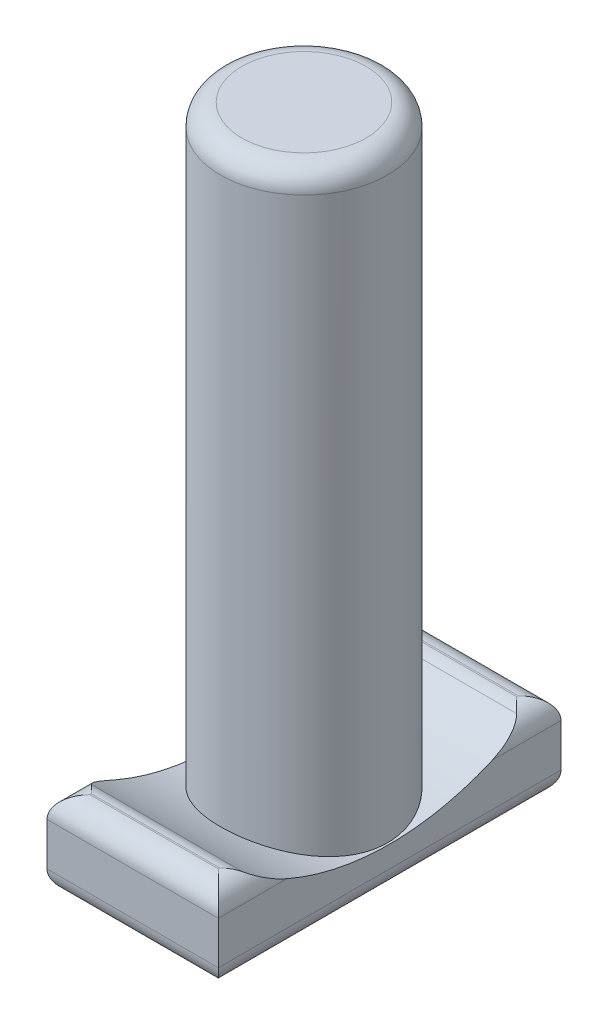
ISO-10303-21;
HEADER;
FILE_DESCRIPTION(('STEP AP214'),'2;1');
FILE_NAME('part.step','',(''),(''),'','','');
FILE_SCHEMA(('AUTOMOTIVE_DESIGN { 1 0 10303 214 1 1 1 1 }'));
ENDSEC;
DATA;
#1=APPLICATION_CONTEXT('core data for automotive mechanical design processes');
#2=APPLICATION_PROTOCOL_DEFINITION('international standard','automotive_design',2000,#1);
#3=PRODUCT_CONTEXT('',#1,'mechanical');
#4=PRODUCT('Part','Part','',(#3));
#5=PRODUCT_RELATED_PRODUCT_CATEGORY('part','',(#4));
#6=PRODUCT_DEFINITION_FORMATION('','',#4);
#7=PRODUCT_DEFINITION_CONTEXT('part definition',#1,'design');
#8=PRODUCT_DEFINITION('design','',#6,#7);
#9=PRODUCT_DEFINITION_SHAPE('','',#8);
#10=(LENGTH_UNIT() NAMED_UNIT(*) SI_UNIT(.MILLI.,.METRE.));
#11=(NAMED_UNIT(*) PLANE_ANGLE_UNIT() SI_UNIT($,.RADIAN.));
#12=(NAMED_UNIT(*) SI_UNIT($,.STERADIAN.) SOLID_ANGLE_UNIT());
#13=UNCERTAINTY_MEASURE_WITH_UNIT(LENGTH_MEASURE(1.E-05),#10,'distance_accuracy_value','');
#14=(GEOMETRIC_REPRESENTATION_CONTEXT(3) GLOBAL_UNCERTAINTY_ASSIGNED_CONTEXT((#13)) GLOBAL_UNIT_ASSIGNED_CONTEXT((#10,
#11,#12)) REPRESENTATION_CONTEXT('',''));
#15=CARTESIAN_POINT('',(0.,0.,0.));
#16=DIRECTION('',(0.,0.,1.));
#17=DIRECTION('',(1.,0.,0.));
#18=AXIS2_PLACEMENT_3D('',#15,#16,#17);
#19=CARTESIAN_POINT('',(0.,2.,0.));
#20=DIRECTION('',(0.,-1.,0.));
#21=DIRECTION('',(0.,0.,-1.));
#22=AXIS2_PLACEMENT_3D('',#19,#20,#21);
#23=PLANE('',#22);
#24=DIRECTION('',(0.,0.,1.));
#25=VECTOR('',#24,1.);
#26=CARTESIAN_POINT('',(0.5,2.,0.));
#27=LINE('',#26,#25);
#28=CARTESIAN_POINT('',(0.5,2.,-0.535898384862244));
#29=VERTEX_POINT('',#28);
#30=CARTESIAN_POINT('',(0.5,2.,-0.5));
#31=VERTEX_POINT('',#30);
#32=EDGE_CURVE('E328',#29,#31,#27,.T.);
#33=ORIENTED_EDGE('',*,*,#32,.T.);
#34=DIRECTION('',(1.,0.,0.));
#35=VECTOR('',#34,1.);
#36=CARTESIAN_POINT('',(0.,2.,-0.5));
#37=LINE('',#36,#35);
#38=CARTESIAN_POINT('',(3.5,2.,-0.5));
#39=VERTEX_POINT('',#38);
#40=EDGE_CURVE('E329',#31,#39,#37,.T.);
#41=ORIENTED_EDGE('',*,*,#40,.T.);
#42=DIRECTION('',(0.,0.,-1.));
#43=VECTOR('',#42,1.);
#44=CARTESIAN_POINT('',(3.5,2.,0.));
#45=LINE('',#44,#43);
#46=CARTESIAN_POINT('',(3.5,2.,-0.535898384862244));
#47=VERTEX_POINT('',#46);
#48=EDGE_CURVE('E173',#39,#47,#45,.T.);
#49=ORIENTED_EDGE('',*,*,#48,.T.);
#50=DIRECTION('',(-1.,0.,0.));
#51=VECTOR('',#50,1.);
#52=CARTESIAN_POINT('',(0.,2.,-0.535898384862244));
#53=LINE('',#52,#51);
#54=EDGE_CURVE('E330',#47,#29,#53,.T.);
#55=ORIENTED_EDGE('',*,*,#54,.T.);
#56=EDGE_LOOP('',(#33,#41,#49,#55));
#57=FACE_BOUND('',#56,.T.);
#58=ADVANCED_FACE('F35',(#57),#23,.F.);
#59=DIRECTION('',(0.,0.,-1.));
#60=VECTOR('',#59,1.);
#61=CARTESIAN_POINT('',(3.5,2.,0.));
#62=LINE('',#61,#60);
#63=CARTESIAN_POINT('',(3.5,2.,-7.46410161513776));
#64=VERTEX_POINT('',#63);
#65=CARTESIAN_POINT('',(3.5,2.,-7.5));
#66=VERTEX_POINT('',#65);
#67=EDGE_CURVE('E44',#64,#66,#62,.T.);
#68=ORIENTED_EDGE('',*,*,#67,.T.);
#69=DIRECTION('',(-1.,0.,0.));
#70=VECTOR('',#69,1.);
#71=CARTESIAN_POINT('',(0.,2.,-7.5));
#72=LINE('',#71,#70);
#73=CARTESIAN_POINT('',(0.5,2.,-7.5));
#74=VERTEX_POINT('',#73);
#75=EDGE_CURVE('E11',#66,#74,#72,.T.);
#76=ORIENTED_EDGE('',*,*,#75,.T.);
#77=DIRECTION('',(0.,0.,1.));
#78=VECTOR('',#77,1.);
#79=CARTESIAN_POINT('',(0.5,2.,0.));
#80=LINE('',#79,#78);
#81=CARTESIAN_POINT('',(0.5,2.,-7.46410161513776));
#82=VERTEX_POINT('',#81);
#83=EDGE_CURVE('E199',#74,#82,#80,.T.);
#84=ORIENTED_EDGE('',*,*,#83,.T.);
#85=DIRECTION('',(-1.,0.,0.));
#86=VECTOR('',#85,1.);
#87=CARTESIAN_POINT('',(0.,2.,-7.46410161513776));
#88=LINE('',#87,#86);
#89=EDGE_CURVE('E55',#82,#64,#88,.F.);
#90=ORIENTED_EDGE('',*,*,#89,.T.);
#91=EDGE_LOOP('',(#68,#76,#84,#90));
#92=FACE_BOUND('',#91,.T.);
#93=ADVANCED_FACE('F255',(#92),#23,.F.);
#94=CARTESIAN_POINT('',(0.,0.,0.));
#95=DIRECTION('',(0.,-1.,0.));
#96=DIRECTION('',(0.,0.,-1.));
#97=AXIS2_PLACEMENT_3D('',#94,#95,#96);
#98=PLANE('',#97);
#99=DIRECTION('',(0.,0.,-1.));
#100=VECTOR('',#99,1.);
#101=CARTESIAN_POINT('',(3.5,0.,0.));
#102=LINE('',#101,#100);
#103=CARTESIAN_POINT('',(3.5,0.,-7.5));
#104=VERTEX_POINT('',#103);
#105=CARTESIAN_POINT('',(3.5,0.,-0.5));
#106=VERTEX_POINT('',#105);
#107=EDGE_CURVE('E382',#104,#106,#102,.F.);
#108=ORIENTED_EDGE('',*,*,#107,.T.);
#109=DIRECTION('',(1.,0.,0.));
#110=VECTOR('',#109,1.);
#111=CARTESIAN_POINT('',(0.,0.,-0.5));
#112=LINE('',#111,#110);
#113=CARTESIAN_POINT('',(0.5,0.,-0.5));
#114=VERTEX_POINT('',#113);
#115=EDGE_CURVE('E384',#106,#114,#112,.F.);
#116=ORIENTED_EDGE('',*,*,#115,.T.);
#117=DIRECTION('',(0.,0.,1.));
#118=VECTOR('',#117,1.);
#119=CARTESIAN_POINT('',(0.5,0.,-8.));
#120=LINE('',#119,#118);
#121=CARTESIAN_POINT('',(0.5,0.,-7.5));
#122=VERTEX_POINT('',#121);
#123=EDGE_CURVE('E378',#114,#122,#120,.F.);
#124=ORIENTED_EDGE('',*,*,#123,.T.);
#125=DIRECTION('',(-1.,0.,0.));
#126=VECTOR('',#125,1.);
#127=CARTESIAN_POINT('',(4.,0.,-7.5));
#128=LINE('',#127,#126);
#129=EDGE_CURVE('E380',#122,#104,#128,.F.);
#130=ORIENTED_EDGE('',*,*,#129,.T.);
#131=EDGE_LOOP('',(#108,#116,#124,#130));
#132=FACE_BOUND('',#131,.T.);
#133=ADVANCED_FACE('F260',(#132),#98,.T.);
#134=CARTESIAN_POINT('',(0.,2.,0.));
#135=DIRECTION('',(1.,0.,0.));
#136=DIRECTION('',(0.,0.,-1.));
#137=AXIS2_PLACEMENT_3D('',#134,#135,#136);
#138=PLANE('',#137);
#139=DIRECTION('',(0.,-1.,0.));
#140=VECTOR('',#139,1.);
#141=CARTESIAN_POINT('',(0.,2.,-8.));
#142=LINE('',#141,#140);
#143=CARTESIAN_POINT('',(0.,1.5,-8.));
#144=VERTEX_POINT('',#143);
#145=CARTESIAN_POINT('',(0.,0.5,-8.));
#146=VERTEX_POINT('',#145);
#147=EDGE_CURVE('E371',#144,#146,#142,.T.);
#148=ORIENTED_EDGE('',*,*,#147,.T.);
#149=DIRECTION('',(0.,0.,1.));
#150=VECTOR('',#149,1.);
#151=CARTESIAN_POINT('',(0.,0.5,0.));
#152=LINE('',#151,#150);
#153=CARTESIAN_POINT('',(0.,0.5,0.));
#154=VERTEX_POINT('',#153);
#155=EDGE_CURVE('E360',#146,#154,#152,.T.);
#156=ORIENTED_EDGE('',*,*,#155,.T.);
#157=DIRECTION('',(0.,-1.,0.));
#158=VECTOR('',#157,1.);
#159=CARTESIAN_POINT('',(0.,2.,0.));
#160=LINE('',#159,#158);
#161=CARTESIAN_POINT('',(0.,1.5,0.));
#162=VERTEX_POINT('',#161);
#163=EDGE_CURVE('E159',#162,#154,#160,.T.);
#164=ORIENTED_EDGE('',*,*,#163,.F.);
#165=DIRECTION('',(0.,0.,1.));
#166=VECTOR('',#165,1.);
#167=CARTESIAN_POINT('',(0.,1.5,0.));
#168=LINE('',#167,#166);
#169=CARTESIAN_POINT('',(0.,1.5,-1.60208423834364));
#170=VERTEX_POINT('',#169);
#171=EDGE_CURVE('E357',#162,#170,#168,.F.);
#172=ORIENTED_EDGE('',*,*,#171,.T.);
#173=CARTESIAN_POINT('',(0.,7.,-4.));
#174=DIRECTION('',(-1.,0.,0.));
#175=DIRECTION('',(0.,0.,1.));
#176=AXIS2_PLACEMENT_3D('',#173,#174,#175);
#177=CIRCLE('',#176,6.);
#178=CARTESIAN_POINT('',(0.,1.5,-6.39791576165636));
#179=VERTEX_POINT('',#178);
#180=EDGE_CURVE('E226',#179,#170,#177,.T.);
#181=ORIENTED_EDGE('',*,*,#180,.F.);
#182=DIRECTION('',(0.,0.,1.));
#183=VECTOR('',#182,1.);
#184=CARTESIAN_POINT('',(0.,1.5,0.));
#185=LINE('',#184,#183);
#186=EDGE_CURVE('E355',#179,#144,#185,.F.);
#187=ORIENTED_EDGE('',*,*,#186,.T.);
#188=EDGE_LOOP('',(#148,#156,#164,#172,#181,#187));
#189=FACE_BOUND('',#188,.T.);
#190=ADVANCED_FACE('F264',(#189),#138,.F.);
#191=CARTESIAN_POINT('',(0.,2.,0.));
#192=DIRECTION('',(0.,0.,-1.));
#193=DIRECTION('',(-1.,0.,0.));
#194=AXIS2_PLACEMENT_3D('',#191,#192,#193);
#195=PLANE('',#194);
#196=ORIENTED_EDGE('',*,*,#163,.T.);
#197=DIRECTION('',(1.,0.,0.));
#198=VECTOR('',#197,1.);
#199=CARTESIAN_POINT('',(4.,0.5,0.));
#200=LINE('',#199,#198);
#201=CARTESIAN_POINT('',(4.,0.5,0.));
#202=VERTEX_POINT('',#201);
#203=EDGE_CURVE('E158',#154,#202,#200,.T.);
#204=ORIENTED_EDGE('',*,*,#203,.T.);
#205=DIRECTION('',(0.,-1.,0.));
#206=VECTOR('',#205,1.);
#207=CARTESIAN_POINT('',(4.,2.,0.));
#208=LINE('',#207,#206);
#209=CARTESIAN_POINT('',(4.,1.5,0.));
#210=VERTEX_POINT('',#209);
#211=EDGE_CURVE('E140',#210,#202,#208,.T.);
#212=ORIENTED_EDGE('',*,*,#211,.F.);
#213=DIRECTION('',(1.,0.,0.));
#214=VECTOR('',#213,1.);
#215=CARTESIAN_POINT('',(0.,1.5,0.));
#216=LINE('',#215,#214);
#217=EDGE_CURVE('E155',#210,#162,#216,.F.);
#218=ORIENTED_EDGE('',*,*,#217,.T.);
#219=EDGE_LOOP('',(#196,#204,#212,#218));
#220=FACE_BOUND('',#219,.T.);
#221=ADVANCED_FACE('F154',(#220),#195,.F.);
#222=CARTESIAN_POINT('',(4.,2.,0.));
#223=DIRECTION('',(-1.,0.,0.));
#224=DIRECTION('',(0.,0.,1.));
#225=AXIS2_PLACEMENT_3D('',#222,#223,#224);
#226=PLANE('',#225);
#227=ORIENTED_EDGE('',*,*,#211,.T.);
#228=DIRECTION('',(0.,0.,-1.));
#229=VECTOR('',#228,1.);
#230=CARTESIAN_POINT('',(4.,0.5,-8.));
#231=LINE('',#230,#229);
#232=CARTESIAN_POINT('',(4.,0.5,-8.));
#233=VERTEX_POINT('',#232);
#234=EDGE_CURVE('E146',#202,#233,#231,.T.);
#235=ORIENTED_EDGE('',*,*,#234,.T.);
#236=DIRECTION('',(0.,-1.,0.));
#237=VECTOR('',#236,1.);
#238=CARTESIAN_POINT('',(4.,2.,-8.));
#239=LINE('',#238,#237);
#240=CARTESIAN_POINT('',(4.,1.5,-8.));
#241=VERTEX_POINT('',#240);
#242=EDGE_CURVE('E160',#241,#233,#239,.T.);
#243=ORIENTED_EDGE('',*,*,#242,.F.);
#244=DIRECTION('',(0.,0.,-1.));
#245=VECTOR('',#244,1.);
#246=CARTESIAN_POINT('',(4.,1.5,0.));
#247=LINE('',#246,#245);
#248=CARTESIAN_POINT('',(4.,1.5,-6.39791576165637));
#249=VERTEX_POINT('',#248);
#250=EDGE_CURVE('E147',#241,#249,#247,.F.);
#251=ORIENTED_EDGE('',*,*,#250,.T.);
#252=CARTESIAN_POINT('',(4.,7.,-4.));
#253=DIRECTION('',(-1.,0.,0.));
#254=DIRECTION('',(0.,0.,1.));
#255=AXIS2_PLACEMENT_3D('',#252,#253,#254);
#256=CIRCLE('',#255,6.);
#257=CARTESIAN_POINT('',(4.,1.5,-1.60208423834364));
#258=VERTEX_POINT('',#257);
#259=EDGE_CURVE('E142',#249,#258,#256,.T.);
#260=ORIENTED_EDGE('',*,*,#259,.T.);
#261=DIRECTION('',(0.,0.,-1.));
#262=VECTOR('',#261,1.);
#263=CARTESIAN_POINT('',(4.,1.5,0.));
#264=LINE('',#263,#262);
#265=EDGE_CURVE('E137',#258,#210,#264,.F.);
#266=ORIENTED_EDGE('',*,*,#265,.T.);
#267=EDGE_LOOP('',(#227,#235,#243,#251,#260,#266));
#268=FACE_BOUND('',#267,.T.);
#269=ADVANCED_FACE('F139',(#268),#226,.F.);
#270=CARTESIAN_POINT('',(0.,2.,-8.));
#271=DIRECTION('',(0.,0.,1.));
#272=DIRECTION('',(1.,0.,0.));
#273=AXIS2_PLACEMENT_3D('',#270,#271,#272);
#274=PLANE('',#273);
#275=ORIENTED_EDGE('',*,*,#242,.T.);
#276=DIRECTION('',(-1.,0.,0.));
#277=VECTOR('',#276,1.);
#278=CARTESIAN_POINT('',(0.,0.5,-8.));
#279=LINE('',#278,#277);
#280=EDGE_CURVE('E358',#233,#146,#279,.T.);
#281=ORIENTED_EDGE('',*,*,#280,.T.);
#282=ORIENTED_EDGE('',*,*,#147,.F.);
#283=DIRECTION('',(-1.,0.,0.));
#284=VECTOR('',#283,1.);
#285=CARTESIAN_POINT('',(0.,1.5,-8.));
#286=LINE('',#285,#284);
#287=EDGE_CURVE('E362',#144,#241,#286,.F.);
#288=ORIENTED_EDGE('',*,*,#287,.T.);
#289=EDGE_LOOP('',(#275,#281,#282,#288));
#290=FACE_BOUND('',#289,.T.);
#291=ADVANCED_FACE('F252',(#290),#274,.F.);
#292=CARTESIAN_POINT('',(4.,7.,-4.));
#293=DIRECTION('',(-1.,0.,0.));
#294=DIRECTION('',(0.,0.,1.));
#295=AXIS2_PLACEMENT_3D('',#292,#293,#294);
#296=CYLINDRICAL_SURFACE('',#295,6.);
#297=CARTESIAN_POINT('',(2.,1.32571590418668,-5.95));
#298=CARTESIAN_POINT('',(2.10637971858013,1.32571580842321,-5.94999997956254));
#299=CARTESIAN_POINT('',(2.21276064743233,1.32269163075082,-5.94126540346461));
#300=CARTESIAN_POINT('',(2.42238153946553,1.31098066008169,-5.9066683803243));
#301=CARTESIAN_POINT('',(2.52562084899583,1.30229269698624,-5.88080239403398));
#302=CARTESIAN_POINT('',(2.72588967077862,1.28033989160069,-5.8129384525824));
#303=CARTESIAN_POINT('',(2.8229304694036,1.26708366621566,-5.7709708523913));
#304=CARTESIAN_POINT('',(3.00862357288995,1.23750028191072,-5.67219771633392));
#305=CARTESIAN_POINT('',(3.09727416782463,1.22117249902327,-5.61538916470885));
#306=CARTESIAN_POINT('',(3.2669661212842,1.18660494055493,-5.48628462647115));
#307=CARTESIAN_POINT('',(3.34764990266521,1.16831924629064,-5.41353083017883));
#308=CARTESIAN_POINT('',(3.49591338027478,1.13228537869169,-5.25557910696733));
#309=CARTESIAN_POINT('',(3.56349108710141,1.11453728730551,-5.17037929427383));
#310=CARTESIAN_POINT('',(3.68522840356604,1.08104930631564,-4.98735761677776));
#311=CARTESIAN_POINT('',(3.73901596288427,1.06536974304587,-4.88927627084194));
#312=CARTESIAN_POINT('',(3.82918937712735,1.03832455489969,-4.68486179676261));
#313=CARTESIAN_POINT('',(3.86557967631704,1.02695782842899,-4.57853078413617));
#314=CARTESIAN_POINT('',(3.91872060743435,1.01014419242158,-4.36438238527835));
#315=CARTESIAN_POINT('',(3.93608322878635,1.004513254836,-4.25673158036636));
#316=CARTESIAN_POINT('',(3.95261905137598,0.999153746029335,-4.03990722257376));
#317=CARTESIAN_POINT('',(3.9517967149738,0.999423726796826,-3.93073404983428));
#318=CARTESIAN_POINT('',(3.93238001433375,1.00570952922537,-3.71828573712995));
#319=CARTESIAN_POINT('',(3.91444983487713,1.01151060882953,-3.61494251023576));
#320=CARTESIAN_POINT('',(3.8624212950399,1.02793942331379,-3.41282065215904));
#321=CARTESIAN_POINT('',(3.82832185398506,1.03856748080345,-3.3140423265565));
#322=CARTESIAN_POINT('',(3.74451926828017,1.06373553278758,-3.12236944146293));
#323=CARTESIAN_POINT('',(3.69462204745769,1.07832384286663,-3.02956634125424));
#324=CARTESIAN_POINT('',(3.58079846292705,1.10988630445717,-2.85344984122828));
#325=CARTESIAN_POINT('',(3.51686833725281,1.12686109530113,-2.77013899522645));
#326=CARTESIAN_POINT('',(3.37342080359893,1.16229936355104,-2.61141670369151));
#327=CARTESIAN_POINT('',(3.29333250156324,1.18079546196406,-2.53652775437596));
#328=CARTESIAN_POINT('',(3.12156974569558,1.21654308183566,-2.40107985787176));
#329=CARTESIAN_POINT('',(3.02989368766359,1.23379443045159,-2.34052289813327));
#330=CARTESIAN_POINT('',(2.83597551648406,1.2652722661995,-2.23478237190782));
#331=CARTESIAN_POINT('',(2.73361186508605,1.27945665346351,-2.18980821632442));
#332=CARTESIAN_POINT('',(2.52218919365386,1.30270483290617,-2.11790743522877));
#333=CARTESIAN_POINT('',(2.41313283325973,1.31177064475135,-2.09097369062225));
#334=CARTESIAN_POINT('',(2.19645947633271,1.32330172627877,-2.05695927670304));
#335=CARTESIAN_POINT('',(2.08898322612603,1.32603478378081,-2.0490725348014));
#336=CARTESIAN_POINT('',(1.87423021895681,1.32533740275547,-2.05110096254106));
#337=CARTESIAN_POINT('',(1.76695343113288,1.32190801397123,-2.06101310022844));
#338=CARTESIAN_POINT('',(1.55923045979844,1.30953807548153,-2.09763515685884));
#339=CARTESIAN_POINT('',(1.45867555258704,1.3007779289854,-2.123795771279));
#340=CARTESIAN_POINT('',(1.26339893559262,1.27892900898455,-2.1915188435254));
#341=CARTESIAN_POINT('',(1.16867823034335,1.26583949250597,-2.23308394510133));
#342=CARTESIAN_POINT('',(0.984558100620239,1.23631167036293,-2.33187982578602));
#343=CARTESIAN_POINT('',(0.895409182565528,1.21978338168802,-2.38954985262642));
#344=CARTESIAN_POINT('',(0.727761659395951,1.18541964555757,-2.51841470825219));
#345=CARTESIAN_POINT('',(0.649266054057323,1.16758383209562,-2.58961333295198));
#346=CARTESIAN_POINT('',(0.501475439527101,1.1316357162023,-2.7473529518404));
#347=CARTESIAN_POINT('',(0.432759422519382,1.11354758195604,-2.83444346214435));
#348=CARTESIAN_POINT('',(0.310885662365936,1.07993526289139,-3.01936161028723));
#349=CARTESIAN_POINT('',(0.257727292849238,1.06441097486022,-3.11718881563485));
#350=CARTESIAN_POINT('',(0.168976369071627,1.03775532609773,-3.32026392217835));
#351=CARTESIAN_POINT('',(0.133263367377019,1.02659395285589,-3.42545503715916));
#352=CARTESIAN_POINT('',(0.0801701452493503,1.00979096758931,-3.64078147923448));
#353=CARTESIAN_POINT('',(0.0627836688754568,1.00414747203005,-3.75091510576062));
#354=CARTESIAN_POINT('',(0.0473780443715017,0.99915125532995,-3.96769099700053));
#355=CARTESIAN_POINT('',(0.0485257046793343,0.999527894339939,-4.07426847788361));
#356=CARTESIAN_POINT('',(0.0681169276608152,1.00587063478241,-4.28564200448286));
#357=CARTESIAN_POINT('',(0.0865592021497246,1.01183631991625,-4.39043818228702));
#358=CARTESIAN_POINT('',(0.139671930956938,1.02859298876772,-4.59377253254565));
#359=CARTESIAN_POINT('',(0.174103763883216,1.03931291975039,-4.69237930412112));
#360=CARTESIAN_POINT('',(0.25799967230395,1.06447398980165,-4.88245850080235));
#361=CARTESIAN_POINT('',(0.307466416739749,1.0789157894932,-4.97392965559422));
#362=CARTESIAN_POINT('',(0.422068671554686,1.11066773102883,-5.15070513492441));
#363=CARTESIAN_POINT('',(0.487701324567006,1.12806198972748,-5.23567187378725));
#364=CARTESIAN_POINT('',(0.63191414307659,1.16353867224259,-5.39365978067048));
#365=CARTESIAN_POINT('',(0.710498335203833,1.18162130872674,-5.46667721954205));
#366=CARTESIAN_POINT('',(0.881832686586616,1.21722091629089,-5.60140772636668));
#367=CARTESIAN_POINT('',(0.9749966435242,1.23469282823391,-5.66260807143324));
#368=CARTESIAN_POINT('',(1.17082456587933,1.26626464704084,-5.76842982084833));
#369=CARTESIAN_POINT('',(1.27348546648612,1.28036563652482,-5.81305655060671));
#370=CARTESIAN_POINT('',(1.47892525047359,1.3026979908342,-5.8820169667178));
#371=CARTESIAN_POINT('',(1.58130794557392,1.31123721265746,-5.90743063240748));
#372=CARTESIAN_POINT('',(1.7891273185847,1.32274537605041,-5.94141961769173));
#373=CARTESIAN_POINT('',(1.89456306483474,1.32571599910144,-5.95000002025634));
#374=CARTESIAN_POINT('',(2.,1.32571590418668,-5.95));
#375=B_SPLINE_CURVE_WITH_KNOTS('',3,(#297,#298,#299,#300,#301,#302,#303,#304,#305,#306,#307,
#308,#309,#310,#311,#312,#313,#314,#315,#316,#317,#318,#319,#320,#321,#322,#323,#324,#325,#326,
#327,#328,#329,#330,#331,#332,#333,#334,#335,#336,#337,#338,#339,#340,#341,#342,#343,#344,#345,
#346,#347,#348,#349,#350,#351,#352,#353,#354,#355,#356,#357,#358,#359,#360,#361,#362,#363,#364,
#365,#366,#367,#368,#369,#370,#371,#372,#373,#374),.UNSPECIFIED.,.T.,.F.,(4,2,2,2,2,2,2,2,2,2,2,
2,2,2,2,2,2,2,2,2,2,2,2,2,2,2,2,2,2,2,2,2,2,2,2,2,2,2,4),(0.,0.31874910302231,0.637564078271926,
0.955780949468647,1.27406253436,1.60308113128031,1.93214963168691,2.26933423790988,
2.60643266162579,2.93233817845924,3.25816372306047,3.57183334325809,3.8855239305518,
4.20322838638348,4.52101811723708,4.853073665433,5.18517523359525,5.52158084755149,
5.8578536310266,6.17962466664992,6.50134089531761,6.81273220723626,7.12417698553702,
7.44512345073686,7.7661601018639,8.10176184926626,8.43735008304967,8.77058737401374,
9.10371087425417,9.42190238700488,9.74007020122768,10.0536353008189,10.3672560958577,
10.6920941558896,11.0170333991597,11.3538882788828,11.6906348270493,12.0066544765947,
12.3225786861895),.UNSPECIFIED.);
#376=CARTESIAN_POINT('',(2.,1.32571590418668,-5.95));
#377=VERTEX_POINT('',#376);
#378=EDGE_CURVE('E220',#377,#377,#375,.T.);
#379=ORIENTED_EDGE('',*,*,#378,.T.);
#380=EDGE_LOOP('',(#379));
#381=FACE_BOUND('',#380,.T.);
#382=ORIENTED_EDGE('',*,*,#180,.T.);
#383=CARTESIAN_POINT('',(0.,1.5,-1.60208423834364));
#384=CARTESIAN_POINT('',(1.85878939399247E-06,1.51197369638099,-1.57462054676115));
#385=CARTESIAN_POINT('',(0.00042978184447906,1.52415264622966,-1.54724810636155));
#386=CARTESIAN_POINT('',(0.00224303446717121,1.5489123178395,-1.4927024260149));
#387=CARTESIAN_POINT('',(0.00362881820712043,1.56149322749092,-1.46552928674649));
#388=CARTESIAN_POINT('',(0.00941644063673662,1.60004789808165,-1.38386566325483));
#389=CARTESIAN_POINT('',(0.0154526475100723,1.62660850804095,-1.32974732232106));
#390=CARTESIAN_POINT('',(0.0325669333870756,1.67955400096239,-1.22581979107264));
#391=CARTESIAN_POINT('',(0.0433642673652599,1.70587517355129,-1.17593339170799));
#392=CARTESIAN_POINT('',(0.0712892470119689,1.75905662316908,-1.07843016723542));
#393=CARTESIAN_POINT('',(0.0883911186475969,1.78591428987745,-1.03080498048469));
#394=CARTESIAN_POINT('',(0.125009382491621,1.83162710688621,-0.952154288277199));
#395=CARTESIAN_POINT('',(0.142457924507809,1.8505870898929,-0.920258108573434));
#396=CARTESIAN_POINT('',(0.172897477956957,1.87841395241543,-0.874350412479542));
#397=CARTESIAN_POINT('',(0.183873164013248,1.88766736138503,-0.859244398464621));
#398=CARTESIAN_POINT('',(0.207443936396373,1.90574622497346,-0.830003363903879));
#399=CARTESIAN_POINT('',(0.220043137965519,1.91457051075561,-0.815870955952497));
#400=CARTESIAN_POINT('',(0.233530644988327,1.92307692307643,-0.802367739873612));
#401=B_SPLINE_CURVE_WITH_KNOTS('',3,(#383,#384,#385,#386,#387,#388,#389,#390,#391,#392,#393,
#394,#395,#396,#397,#398,#399,#400),.UNSPECIFIED.,.F.,.F.,(4,2,2,2,2,2,2,2,4),(0.,
0.0898722104226554,0.179787063265112,0.361302683386918,0.533307622329089,0.704617035652506,
0.82723563518783,0.889673068413773,0.952271999683119),.UNSPECIFIED.);
#402=CARTESIAN_POINT('',(0.233530644986058,1.92307692307692,-0.80236773987284));
#403=VERTEX_POINT('',#402);
#404=EDGE_CURVE('E207',#170,#403,#401,.T.);
#405=ORIENTED_EDGE('',*,*,#404,.T.);
#406=DIRECTION('',(-1.,0.,0.));
#407=VECTOR('',#406,1.);
#408=CARTESIAN_POINT('',(4.,1.92307692307692,-0.80236773987284));
#409=LINE('',#408,#407);
#410=CARTESIAN_POINT('',(3.76646935501394,1.92307692307692,-0.80236773987284));
#411=VERTEX_POINT('',#410);
#412=EDGE_CURVE('E309',#403,#411,#409,.F.);
#413=ORIENTED_EDGE('',*,*,#412,.T.);
#414=CARTESIAN_POINT('',(3.76646935501394,1.92307692307692,-0.80236773987284));
#415=CARTESIAN_POINT('',(3.78032618245598,1.91433695456125,-0.816241700389874));
#416=CARTESIAN_POINT('',(3.79324438833162,1.90526300151055,-0.830777316626955));
#417=CARTESIAN_POINT('',(3.81736584411162,1.88666826897617,-0.860868472935338));
#418=CARTESIAN_POINT('',(3.82857384781752,1.87714882787831,-0.876421007564945));
#419=CARTESIAN_POINT('',(3.85973430543136,1.84840404802327,-0.923896456568105));
#420=CARTESIAN_POINT('',(3.87754193997071,1.82877572281133,-0.956978772251039));
#421=CARTESIAN_POINT('',(3.90682163850411,1.79153231919009,-1.02122644688037));
#422=CARTESIAN_POINT('',(3.91877928674436,1.77393734704768,-1.05219296821893));
#423=CARTESIAN_POINT('',(3.9397112753723,1.73889201412381,-1.11520452565129));
#424=CARTESIAN_POINT('',(3.9486841232755,1.72144172992988,-1.1472500925058));
#425=CARTESIAN_POINT('',(3.97201331873551,1.66932112906676,-1.24512411886052));
#426=CARTESIAN_POINT('',(3.98255994922083,1.6351926676591,-1.31215510851992));
#427=CARTESIAN_POINT('',(3.99316020899591,1.58438751291726,-1.41681842699155));
#428=CARTESIAN_POINT('',(3.99580743408915,1.56687857217797,-1.45385062251901));
#429=CARTESIAN_POINT('',(3.99921288048758,1.53279407660701,-1.52789629795167));
#430=CARTESIAN_POINT('',(3.99999319033021,1.5162098983774,-1.56490476387393));
#431=CARTESIAN_POINT('',(4.,1.5,-1.60208423834364));
#432=B_SPLINE_CURVE_WITH_KNOTS('',3,(#414,#415,#416,#417,#418,#419,#420,#421,#422,#423,#424,
#425,#426,#427,#428,#429,#430,#431),.UNSPECIFIED.,.F.,.F.,(4,2,2,2,2,2,2,2,4),(0.,
0.0643077573473193,0.128433369543035,0.255159869899291,0.367726454125083,0.48034924050969,
0.707546313830163,0.830658513821494,0.95230673944105),.UNSPECIFIED.);
#433=EDGE_CURVE('E303',#411,#258,#432,.T.);
#434=ORIENTED_EDGE('',*,*,#433,.T.);
#435=ORIENTED_EDGE('',*,*,#259,.F.);
#436=CARTESIAN_POINT('',(4.,1.5,-6.39791576165637));
#437=CARTESIAN_POINT('',(3.99999814121061,1.51197369638099,-6.42537945323885));
#438=CARTESIAN_POINT('',(3.99957021815552,1.52415264622966,-6.45275189363845));
#439=CARTESIAN_POINT('',(3.99775696553283,1.5489123178395,-6.50729757398511));
#440=CARTESIAN_POINT('',(3.99637118179288,1.56149322749092,-6.53447071325351));
#441=CARTESIAN_POINT('',(3.99058355936326,1.60004789808164,-6.61613433674517));
#442=CARTESIAN_POINT('',(3.98454735248993,1.62660850804095,-6.67025267767894));
#443=CARTESIAN_POINT('',(3.96743306661292,1.67955400096239,-6.77418020892735));
#444=CARTESIAN_POINT('',(3.95663573263474,1.70587517355129,-6.82406660829201));
#445=CARTESIAN_POINT('',(3.92871075298803,1.75905662316908,-6.92156983276457));
#446=CARTESIAN_POINT('',(3.91160888135241,1.78591428987744,-6.96919501951531));
#447=CARTESIAN_POINT('',(3.87499061750838,1.83162710688621,-7.0478457117228));
#448=CARTESIAN_POINT('',(3.85754207549219,1.8505870898929,-7.07974189142656));
#449=CARTESIAN_POINT('',(3.82710252204305,1.87841395241543,-7.12564958752045));
#450=CARTESIAN_POINT('',(3.81612683598675,1.88766736138503,-7.14075560153538));
#451=CARTESIAN_POINT('',(3.79255606360363,1.90574622497346,-7.16999663609612));
#452=CARTESIAN_POINT('',(3.77995686203448,1.91457051075561,-7.1841290440475));
#453=CARTESIAN_POINT('',(3.76646935501167,1.92307692307643,-7.19763226012639));
#454=B_SPLINE_CURVE_WITH_KNOTS('',3,(#436,#437,#438,#439,#440,#441,#442,#443,#444,#445,#446,
#447,#448,#449,#450,#451,#452,#453),.UNSPECIFIED.,.F.,.F.,(4,2,2,2,2,2,2,2,4),(0.,
0.0898722104226531,0.179787063265108,0.361302683386909,0.533307622329076,0.70461703565249,
0.827235635187819,0.889673068413765,0.952271999683113),.UNSPECIFIED.);
#455=CARTESIAN_POINT('',(3.76646935501394,1.92307692307692,-7.19763226012716));
#456=VERTEX_POINT('',#455);
#457=EDGE_CURVE('E310',#249,#456,#454,.T.);
#458=ORIENTED_EDGE('',*,*,#457,.T.);
#459=DIRECTION('',(-1.,0.,0.));
#460=VECTOR('',#459,1.);
#461=CARTESIAN_POINT('',(4.,1.92307692307692,-7.19763226012716));
#462=LINE('',#461,#460);
#463=CARTESIAN_POINT('',(0.233530644986058,1.92307692307692,-7.19763226012716));
#464=VERTEX_POINT('',#463);
#465=EDGE_CURVE('E204',#456,#464,#462,.T.);
#466=ORIENTED_EDGE('',*,*,#465,.T.);
#467=CARTESIAN_POINT('',(0.233530644986058,1.92307692307692,-7.19763226012716));
#468=CARTESIAN_POINT('',(0.219673817544022,1.91433695456125,-7.18375829961013));
#469=CARTESIAN_POINT('',(0.206755611668383,1.90526300151054,-7.16922268337304));
#470=CARTESIAN_POINT('',(0.182634155888382,1.88666826897617,-7.13913152706466));
#471=CARTESIAN_POINT('',(0.171426152182483,1.87714882787831,-7.12357899243505));
#472=CARTESIAN_POINT('',(0.140265694568645,1.84840404802327,-7.07610354343189));
#473=CARTESIAN_POINT('',(0.122458060029293,1.82877572281133,-7.04302122774896));
#474=CARTESIAN_POINT('',(0.0931783614958898,1.79153231919009,-6.97877355311963));
#475=CARTESIAN_POINT('',(0.0812207132556365,1.77393734704768,-6.94780703178107));
#476=CARTESIAN_POINT('',(0.0602887246276988,1.73889201412381,-6.88479547434871));
#477=CARTESIAN_POINT('',(0.0513158767244967,1.72144172992988,-6.8527499074942));
#478=CARTESIAN_POINT('',(0.0279866812644863,1.66932112906675,-6.75487588113948));
#479=CARTESIAN_POINT('',(0.0174400507791733,1.6351926676591,-6.68784489148008));
#480=CARTESIAN_POINT('',(0.00683979100409405,1.58438751291726,-6.58318157300845));
#481=CARTESIAN_POINT('',(0.00419256591085365,1.56687857217797,-6.546149377481));
#482=CARTESIAN_POINT('',(0.000787119512416929,1.53279407660701,-6.47210370204833));
#483=CARTESIAN_POINT('',(6.80966978819667E-06,1.5162098983774,-6.43509523612607));
#484=CARTESIAN_POINT('',(0.,1.5,-6.39791576165636));
#485=B_SPLINE_CURVE_WITH_KNOTS('',3,(#467,#468,#469,#470,#471,#472,#473,#474,#475,#476,#477,
#478,#479,#480,#481,#482,#483,#484),.UNSPECIFIED.,.F.,.F.,(4,2,2,2,2,2,2,2,4),(0.,
0.0643077573473198,0.128433369543036,0.25515986989929,0.367726454125083,0.480349240509691,
0.707546313830164,0.830658513821494,0.952306739441048),.UNSPECIFIED.);
#486=EDGE_CURVE('E201',#464,#179,#485,.T.);
#487=ORIENTED_EDGE('',*,*,#486,.T.);
#488=EDGE_LOOP('',(#382,#405,#413,#434,#435,#458,#466,#487));
#489=FACE_BOUND('',#488,.T.);
#490=ADVANCED_FACE('F237',(#381,#489),#296,.F.);
#491=CARTESIAN_POINT('',(2.,15.,-4.));
#492=DIRECTION('',(0.,-1.,0.));
#493=DIRECTION('',(0.,0.,-1.));
#494=AXIS2_PLACEMENT_3D('',#491,#492,#493);
#495=PLANE('',#494);
#496=CARTESIAN_POINT('',(2.,15.,-4.));
#497=DIRECTION('',(0.,-1.,0.));
#498=DIRECTION('',(0.,0.,-1.));
#499=AXIS2_PLACEMENT_3D('',#496,#497,#498);
#500=CIRCLE('',#499,1.45);
#501=CARTESIAN_POINT('',(2.,15.,-5.45));
#502=VERTEX_POINT('',#501);
#503=EDGE_CURVE('E370',#502,#502,#500,.F.);
#504=ORIENTED_EDGE('',*,*,#503,.T.);
#505=EDGE_LOOP('',(#504));
#506=FACE_BOUND('',#505,.T.);
#507=ADVANCED_FACE('F245',(#506),#495,.F.);
#508=CARTESIAN_POINT('',(2.,15.,-4.));
#509=DIRECTION('',(0.,-1.,0.));
#510=DIRECTION('',(0.,0.,-1.));
#511=AXIS2_PLACEMENT_3D('',#508,#509,#510);
#512=CYLINDRICAL_SURFACE('',#511,1.95);
#513=CARTESIAN_POINT('',(2.,14.5,-4.));
#514=DIRECTION('',(0.,-1.,0.));
#515=DIRECTION('',(0.,0.,-1.));
#516=AXIS2_PLACEMENT_3D('',#513,#514,#515);
#517=CIRCLE('',#516,1.95);
#518=CARTESIAN_POINT('',(2.,14.5,-5.95));
#519=VERTEX_POINT('',#518);
#520=EDGE_CURVE('E367',#519,#519,#517,.T.);
#521=ORIENTED_EDGE('',*,*,#520,.T.);
#522=EDGE_LOOP('',(#521));
#523=FACE_BOUND('',#522,.T.);
#524=ORIENTED_EDGE('',*,*,#378,.F.);
#525=EDGE_LOOP('',(#524));
#526=FACE_BOUND('',#525,.T.);
#527=ADVANCED_FACE('F240',(#523,#526),#512,.T.);
#528=CARTESIAN_POINT('',(0.,0.5,-7.5));
#529=DIRECTION('',(1.,0.,0.));
#530=DIRECTION('',(0.,0.,-1.));
#531=AXIS2_PLACEMENT_3D('',#528,#529,#530);
#532=CYLINDRICAL_SURFACE('',#531,0.5);
#533=CARTESIAN_POINT('',(3.5,0.5,-7.5));
#534=DIRECTION('',(0.707106781186547,0.,0.707106781186547));
#535=DIRECTION('',(0.707106781186547,0.,-0.707106781186547));
#536=AXIS2_PLACEMENT_3D('',#533,#534,#535);
#537=ELLIPSE('',#536,0.707106781186547,0.5);
#538=EDGE_CURVE('E213',#104,#233,#537,.T.);
#539=ORIENTED_EDGE('',*,*,#538,.F.);
#540=ORIENTED_EDGE('',*,*,#129,.F.);
#541=CARTESIAN_POINT('',(0.5,0.5,-7.5));
#542=DIRECTION('',(0.707106781186547,0.,-0.707106781186547));
#543=DIRECTION('',(-0.707106781186547,0.,-0.707106781186547));
#544=AXIS2_PLACEMENT_3D('',#541,#542,#543);
#545=ELLIPSE('',#544,0.707106781186547,0.5);
#546=EDGE_CURVE('E181',#146,#122,#545,.F.);
#547=ORIENTED_EDGE('',*,*,#546,.F.);
#548=ORIENTED_EDGE('',*,*,#280,.F.);
#549=EDGE_LOOP('',(#539,#540,#547,#548));
#550=FACE_BOUND('',#549,.T.);
#551=ADVANCED_FACE('F244',(#550),#532,.T.);
#552=CARTESIAN_POINT('',(0.5,0.5,0.));
#553=DIRECTION('',(0.,0.,-1.));
#554=DIRECTION('',(-1.,0.,0.));
#555=AXIS2_PLACEMENT_3D('',#552,#553,#554);
#556=CYLINDRICAL_SURFACE('',#555,0.5);
#557=ORIENTED_EDGE('',*,*,#546,.T.);
#558=ORIENTED_EDGE('',*,*,#123,.F.);
#559=CARTESIAN_POINT('',(0.5,0.5,-0.5));
#560=DIRECTION('',(-0.707106781186547,0.,-0.707106781186547));
#561=DIRECTION('',(0.707106781186547,0.,-0.707106781186547));
#562=AXIS2_PLACEMENT_3D('',#559,#560,#561);
#563=ELLIPSE('',#562,0.707106781186547,0.5);
#564=EDGE_CURVE('E212',#154,#114,#563,.F.);
#565=ORIENTED_EDGE('',*,*,#564,.F.);
#566=ORIENTED_EDGE('',*,*,#155,.F.);
#567=EDGE_LOOP('',(#557,#558,#565,#566));
#568=FACE_BOUND('',#567,.T.);
#569=ADVANCED_FACE('F284',(#568),#556,.T.);
#570=CARTESIAN_POINT('',(3.5,0.5,0.));
#571=DIRECTION('',(0.,0.,1.));
#572=DIRECTION('',(1.,0.,0.));
#573=AXIS2_PLACEMENT_3D('',#570,#571,#572);
#574=CYLINDRICAL_SURFACE('',#573,0.5);
#575=ORIENTED_EDGE('',*,*,#538,.T.);
#576=ORIENTED_EDGE('',*,*,#234,.F.);
#577=CARTESIAN_POINT('',(3.5,0.5,-0.5));
#578=DIRECTION('',(-0.707106781186547,0.,0.707106781186547));
#579=DIRECTION('',(0.707106781186547,0.,0.707106781186547));
#580=AXIS2_PLACEMENT_3D('',#577,#578,#579);
#581=ELLIPSE('',#580,0.707106781186547,0.5);
#582=EDGE_CURVE('E188',#106,#202,#581,.T.);
#583=ORIENTED_EDGE('',*,*,#582,.F.);
#584=ORIENTED_EDGE('',*,*,#107,.F.);
#585=EDGE_LOOP('',(#575,#576,#583,#584));
#586=FACE_BOUND('',#585,.T.);
#587=ADVANCED_FACE('F280',(#586),#574,.T.);
#588=CARTESIAN_POINT('',(0.,0.5,-0.5));
#589=DIRECTION('',(-1.,0.,0.));
#590=DIRECTION('',(0.,0.,1.));
#591=AXIS2_PLACEMENT_3D('',#588,#589,#590);
#592=CYLINDRICAL_SURFACE('',#591,0.5);
#593=ORIENTED_EDGE('',*,*,#564,.T.);
#594=ORIENTED_EDGE('',*,*,#115,.F.);
#595=ORIENTED_EDGE('',*,*,#582,.T.);
#596=ORIENTED_EDGE('',*,*,#203,.F.);
#597=EDGE_LOOP('',(#593,#594,#595,#596));
#598=FACE_BOUND('',#597,.T.);
#599=ADVANCED_FACE('F276',(#598),#592,.T.);
#600=CARTESIAN_POINT('',(2.,14.5,-4.));
#601=DIRECTION('',(0.,-1.,0.));
#602=DIRECTION('',(0.,0.,-1.));
#603=AXIS2_PLACEMENT_3D('',#600,#601,#602);
#604=TOROIDAL_SURFACE('',#603,1.45,0.5);
#605=ORIENTED_EDGE('',*,*,#503,.F.);
#606=EDGE_LOOP('',(#605));
#607=FACE_BOUND('',#606,.T.);
#608=ORIENTED_EDGE('',*,*,#520,.F.);
#609=EDGE_LOOP('',(#608));
#610=FACE_BOUND('',#609,.T.);
#611=ADVANCED_FACE('F279',(#607,#610),#604,.T.);
#612=CARTESIAN_POINT('',(4.,1.5,-0.535898384862244));
#613=DIRECTION('',(-1.,0.,0.));
#614=DIRECTION('',(0.,0.,1.));
#615=AXIS2_PLACEMENT_3D('',#612,#613,#614);
#616=CYLINDRICAL_SURFACE('',#615,0.5);
#617=CARTESIAN_POINT('',(3.5,1.5,-0.535898384862244));
#618=DIRECTION('',(-0.707106781186547,0.,-0.707106781186547));
#619=DIRECTION('',(0.707106781186547,0.,-0.707106781186547));
#620=AXIS2_PLACEMENT_3D('',#617,#618,#619);
#621=ELLIPSE('',#620,0.707106781186547,0.5);
#622=EDGE_CURVE('E176',#411,#47,#621,.F.);
#623=ORIENTED_EDGE('',*,*,#622,.F.);
#624=ORIENTED_EDGE('',*,*,#412,.F.);
#625=CARTESIAN_POINT('',(0.5,1.5,-0.535898384862244));
#626=DIRECTION('',(-0.707106781186547,0.,0.707106781186547));
#627=DIRECTION('',(-0.707106781186547,0.,-0.707106781186547));
#628=AXIS2_PLACEMENT_3D('',#625,#626,#627);
#629=ELLIPSE('',#628,0.707106781186547,0.5);
#630=EDGE_CURVE('E185',#29,#403,#629,.T.);
#631=ORIENTED_EDGE('',*,*,#630,.F.);
#632=ORIENTED_EDGE('',*,*,#54,.F.);
#633=EDGE_LOOP('',(#623,#624,#631,#632));
#634=FACE_BOUND('',#633,.T.);
#635=ADVANCED_FACE('F292',(#634),#616,.T.);
#636=CARTESIAN_POINT('',(0.5,1.5,0.));
#637=DIRECTION('',(0.,0.,1.));
#638=DIRECTION('',(1.,0.,0.));
#639=AXIS2_PLACEMENT_3D('',#636,#637,#638);
#640=CYLINDRICAL_SURFACE('',#639,0.5);
#641=ORIENTED_EDGE('',*,*,#404,.F.);
#642=ORIENTED_EDGE('',*,*,#171,.F.);
#643=CARTESIAN_POINT('',(0.5,1.5,-0.5));
#644=DIRECTION('',(0.707106781186547,0.,0.707106781186547));
#645=DIRECTION('',(-0.707106781186547,0.,0.707106781186547));
#646=AXIS2_PLACEMENT_3D('',#643,#644,#645);
#647=ELLIPSE('',#646,0.707106781186547,0.5);
#648=EDGE_CURVE('E168',#31,#162,#647,.T.);
#649=ORIENTED_EDGE('',*,*,#648,.F.);
#650=ORIENTED_EDGE('',*,*,#32,.F.);
#651=ORIENTED_EDGE('',*,*,#630,.T.);
#652=EDGE_LOOP('',(#641,#642,#649,#650,#651));
#653=FACE_BOUND('',#652,.T.);
#654=ADVANCED_FACE('F299',(#653),#640,.T.);
#655=CARTESIAN_POINT('',(3.5,1.5,0.));
#656=DIRECTION('',(0.,0.,-1.));
#657=DIRECTION('',(-1.,0.,0.));
#658=AXIS2_PLACEMENT_3D('',#655,#656,#657);
#659=CYLINDRICAL_SURFACE('',#658,0.5);
#660=ORIENTED_EDGE('',*,*,#622,.T.);
#661=ORIENTED_EDGE('',*,*,#48,.F.);
#662=CARTESIAN_POINT('',(3.5,1.5,-0.5));
#663=DIRECTION('',(0.707106781186547,0.,-0.707106781186547));
#664=DIRECTION('',(-0.707106781186547,0.,-0.707106781186547));
#665=AXIS2_PLACEMENT_3D('',#662,#663,#664);
#666=ELLIPSE('',#665,0.707106781186547,0.5);
#667=EDGE_CURVE('E165',#210,#39,#666,.F.);
#668=ORIENTED_EDGE('',*,*,#667,.F.);
#669=ORIENTED_EDGE('',*,*,#265,.F.);
#670=ORIENTED_EDGE('',*,*,#433,.F.);
#671=EDGE_LOOP('',(#660,#661,#668,#669,#670));
#672=FACE_BOUND('',#671,.T.);
#673=ADVANCED_FACE('F172',(#672),#659,.T.);
#674=CARTESIAN_POINT('',(0.,1.5,-0.5));
#675=DIRECTION('',(1.,0.,0.));
#676=DIRECTION('',(0.,0.,-1.));
#677=AXIS2_PLACEMENT_3D('',#674,#675,#676);
#678=CYLINDRICAL_SURFACE('',#677,0.5);
#679=ORIENTED_EDGE('',*,*,#648,.T.);
#680=ORIENTED_EDGE('',*,*,#217,.F.);
#681=ORIENTED_EDGE('',*,*,#667,.T.);
#682=ORIENTED_EDGE('',*,*,#40,.F.);
#683=EDGE_LOOP('',(#679,#680,#681,#682));
#684=FACE_BOUND('',#683,.T.);
#685=ADVANCED_FACE('F163',(#684),#678,.T.);
#686=CARTESIAN_POINT('',(4.,1.5,-7.46410161513776));
#687=DIRECTION('',(-1.,0.,0.));
#688=DIRECTION('',(0.,0.,1.));
#689=AXIS2_PLACEMENT_3D('',#686,#687,#688);
#690=CYLINDRICAL_SURFACE('',#689,0.5);
#691=CARTESIAN_POINT('',(0.5,1.5,-7.46410161513776));
#692=DIRECTION('',(0.707106781186547,0.,0.707106781186547));
#693=DIRECTION('',(-0.707106781186547,0.,0.707106781186547));
#694=AXIS2_PLACEMENT_3D('',#691,#692,#693);
#695=ELLIPSE('',#694,0.707106781186547,0.5);
#696=EDGE_CURVE('E179',#464,#82,#695,.F.);
#697=ORIENTED_EDGE('',*,*,#696,.F.);
#698=ORIENTED_EDGE('',*,*,#465,.F.);
#699=CARTESIAN_POINT('',(3.5,1.5,-7.46410161513776));
#700=DIRECTION('',(-0.707106781186547,0.,0.707106781186547));
#701=DIRECTION('',(-0.707106781186547,0.,-0.707106781186547));
#702=AXIS2_PLACEMENT_3D('',#699,#700,#701);
#703=ELLIPSE('',#702,0.707106781186547,0.5);
#704=EDGE_CURVE('E39',#64,#456,#703,.F.);
#705=ORIENTED_EDGE('',*,*,#704,.F.);
#706=ORIENTED_EDGE('',*,*,#89,.F.);
#707=EDGE_LOOP('',(#697,#698,#705,#706));
#708=FACE_BOUND('',#707,.T.);
#709=ADVANCED_FACE('F37',(#708),#690,.T.);
#710=CARTESIAN_POINT('',(3.5,1.5,0.));
#711=DIRECTION('',(0.,0.,-1.));
#712=DIRECTION('',(-1.,0.,0.));
#713=AXIS2_PLACEMENT_3D('',#710,#711,#712);
#714=CYLINDRICAL_SURFACE('',#713,0.5);
#715=ORIENTED_EDGE('',*,*,#457,.F.);
#716=ORIENTED_EDGE('',*,*,#250,.F.);
#717=CARTESIAN_POINT('',(3.5,1.5,-7.5));
#718=DIRECTION('',(-0.707106781186547,0.,-0.707106781186547));
#719=DIRECTION('',(0.707106781186547,0.,-0.707106781186547));
#720=AXIS2_PLACEMENT_3D('',#717,#718,#719);
#721=ELLIPSE('',#720,0.707106781186547,0.5);
#722=EDGE_CURVE('E191',#66,#241,#721,.T.);
#723=ORIENTED_EDGE('',*,*,#722,.F.);
#724=ORIENTED_EDGE('',*,*,#67,.F.);
#725=ORIENTED_EDGE('',*,*,#704,.T.);
#726=EDGE_LOOP('',(#715,#716,#723,#724,#725));
#727=FACE_BOUND('',#726,.T.);
#728=ADVANCED_FACE('F344',(#727),#714,.T.);
#729=CARTESIAN_POINT('',(0.5,1.5,0.));
#730=DIRECTION('',(0.,0.,1.));
#731=DIRECTION('',(1.,0.,0.));
#732=AXIS2_PLACEMENT_3D('',#729,#730,#731);
#733=CYLINDRICAL_SURFACE('',#732,0.5);
#734=ORIENTED_EDGE('',*,*,#696,.T.);
#735=ORIENTED_EDGE('',*,*,#83,.F.);
#736=CARTESIAN_POINT('',(0.5,1.5,-7.5));
#737=DIRECTION('',(-0.707106781186547,0.,0.707106781186547));
#738=DIRECTION('',(0.707106781186547,0.,0.707106781186547));
#739=AXIS2_PLACEMENT_3D('',#736,#737,#738);
#740=ELLIPSE('',#739,0.707106781186547,0.5);
#741=EDGE_CURVE('E189',#144,#74,#740,.F.);
#742=ORIENTED_EDGE('',*,*,#741,.F.);
#743=ORIENTED_EDGE('',*,*,#186,.F.);
#744=ORIENTED_EDGE('',*,*,#486,.F.);
#745=EDGE_LOOP('',(#734,#735,#742,#743,#744));
#746=FACE_BOUND('',#745,.T.);
#747=ADVANCED_FACE('F197',(#746),#733,.T.);
#748=CARTESIAN_POINT('',(0.,1.5,-7.5));
#749=DIRECTION('',(-1.,0.,0.));
#750=DIRECTION('',(0.,0.,1.));
#751=AXIS2_PLACEMENT_3D('',#748,#749,#750);
#752=CYLINDRICAL_SURFACE('',#751,0.5);
#753=ORIENTED_EDGE('',*,*,#722,.T.);
#754=ORIENTED_EDGE('',*,*,#287,.F.);
#755=ORIENTED_EDGE('',*,*,#741,.T.);
#756=ORIENTED_EDGE('',*,*,#75,.F.);
#757=EDGE_LOOP('',(#753,#754,#755,#756));
#758=FACE_BOUND('',#757,.T.);
#759=ADVANCED_FACE('F343',(#758),#752,.T.);
#760=CLOSED_SHELL('',(#58,#93,#133,#190,#221,#269,#291,#490,#507,#527,#551,#569,#587,#599,#611,
#635,#654,#673,#685,#709,#728,#747,#759));
#761=MANIFOLD_SOLID_BREP('B2',#760);
#762=ADVANCED_BREP_SHAPE_REPRESENTATION('',(#18,#761),#14);
#763=SHAPE_DEFINITION_REPRESENTATION(#9,#762);
ENDSEC;
END-ISO-10303-21;
